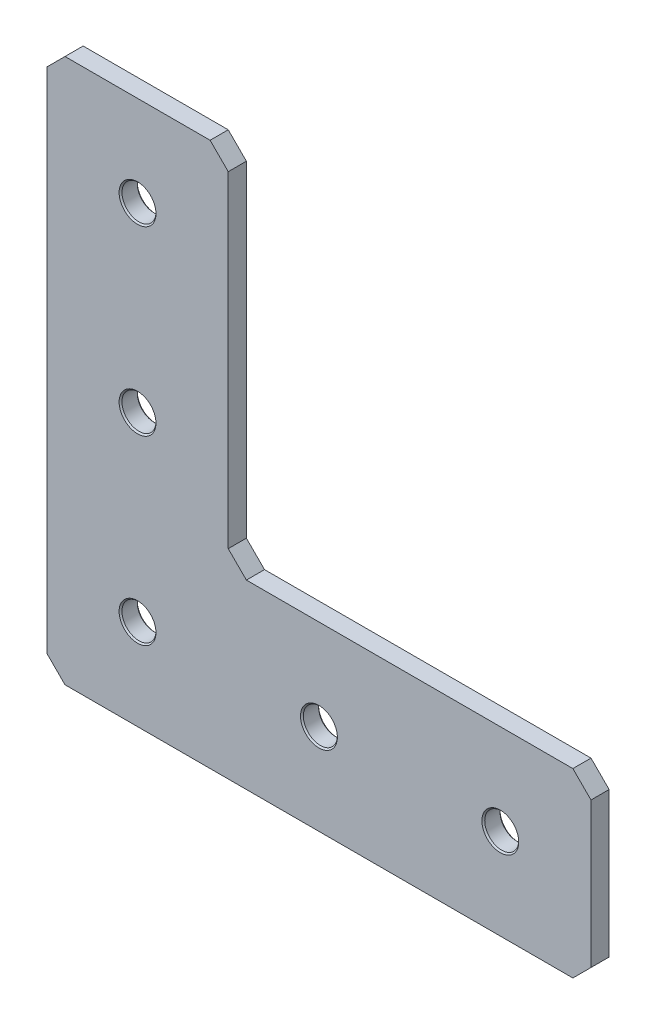
ISO-10303-21;
HEADER;
FILE_DESCRIPTION(('STEP AP214'),'2;1');
FILE_NAME('part.step','',(''),(''),'','','');
FILE_SCHEMA(('AUTOMOTIVE_DESIGN { 1 0 10303 214 1 1 1 1 }'));
ENDSEC;
DATA;
#1=APPLICATION_CONTEXT('core data for automotive mechanical design processes');
#2=APPLICATION_PROTOCOL_DEFINITION('international standard','automotive_design',2000,#1);
#3=PRODUCT_CONTEXT('',#1,'mechanical');
#4=PRODUCT('Part','Part','',(#3));
#5=PRODUCT_RELATED_PRODUCT_CATEGORY('part','',(#4));
#6=PRODUCT_DEFINITION_FORMATION('','',#4);
#7=PRODUCT_DEFINITION_CONTEXT('part definition',#1,'design');
#8=PRODUCT_DEFINITION('design','',#6,#7);
#9=PRODUCT_DEFINITION_SHAPE('','',#8);
#10=(LENGTH_UNIT() NAMED_UNIT(*) SI_UNIT(.MILLI.,.METRE.));
#11=(NAMED_UNIT(*) PLANE_ANGLE_UNIT() SI_UNIT($,.RADIAN.));
#12=(NAMED_UNIT(*) SI_UNIT($,.STERADIAN.) SOLID_ANGLE_UNIT());
#13=UNCERTAINTY_MEASURE_WITH_UNIT(LENGTH_MEASURE(1.E-05),#10,'distance_accuracy_value','');
#14=(GEOMETRIC_REPRESENTATION_CONTEXT(3) GLOBAL_UNCERTAINTY_ASSIGNED_CONTEXT((#13)) GLOBAL_UNIT_ASSIGNED_CONTEXT((#10,
#11,#12)) REPRESENTATION_CONTEXT('',''));
#15=CARTESIAN_POINT('',(0.,0.,0.));
#16=DIRECTION('',(0.,0.,1.));
#17=DIRECTION('',(1.,0.,0.));
#18=AXIS2_PLACEMENT_3D('',#15,#16,#17);
#19=CARTESIAN_POINT('',(0.,0.,2.54));
#20=DIRECTION('',(0.,-1.,0.));
#21=DIRECTION('',(0.,0.,-1.));
#22=AXIS2_PLACEMENT_3D('',#19,#20,#21);
#23=PLANE('',#22);
#24=DIRECTION('',(-1.,0.,0.));
#25=VECTOR('',#24,1.);
#26=CARTESIAN_POINT('',(0.,0.,2.54));
#27=LINE('',#26,#25);
#28=CARTESIAN_POINT('',(48.26,0.,2.54));
#29=VERTEX_POINT('',#28);
#30=CARTESIAN_POINT('',(2.54,0.,2.54));
#31=VERTEX_POINT('',#30);
#32=EDGE_CURVE('E151',#29,#31,#27,.T.);
#33=ORIENTED_EDGE('',*,*,#32,.F.);
#34=DIRECTION('',(0.,0.,-1.));
#35=VECTOR('',#34,1.);
#36=CARTESIAN_POINT('',(48.26,0.,2.54));
#37=LINE('',#36,#35);
#38=CARTESIAN_POINT('',(48.26,0.,0.));
#39=VERTEX_POINT('',#38);
#40=EDGE_CURVE('E183',#29,#39,#37,.T.);
#41=ORIENTED_EDGE('',*,*,#40,.T.);
#42=DIRECTION('',(-1.,0.,0.));
#43=VECTOR('',#42,1.);
#44=CARTESIAN_POINT('',(0.,0.,0.));
#45=LINE('',#44,#43);
#46=CARTESIAN_POINT('',(2.54,0.,0.));
#47=VERTEX_POINT('',#46);
#48=EDGE_CURVE('E415',#39,#47,#45,.T.);
#49=ORIENTED_EDGE('',*,*,#48,.T.);
#50=DIRECTION('',(0.,0.,1.));
#51=VECTOR('',#50,1.);
#52=CARTESIAN_POINT('',(2.54,0.,2.54));
#53=LINE('',#52,#51);
#54=EDGE_CURVE('E181',#47,#31,#53,.T.);
#55=ORIENTED_EDGE('',*,*,#54,.T.);
#56=EDGE_LOOP('',(#33,#41,#49,#55));
#57=FACE_BOUND('',#56,.T.);
#58=ADVANCED_FACE('F32',(#57),#23,.F.);
#59=CARTESIAN_POINT('',(0.,0.,2.54));
#60=DIRECTION('',(-1.,0.,0.));
#61=DIRECTION('',(0.,-1.,0.));
#62=AXIS2_PLACEMENT_3D('',#59,#60,#61);
#63=PLANE('',#62);
#64=DIRECTION('',(0.,1.,0.));
#65=VECTOR('',#64,1.);
#66=CARTESIAN_POINT('',(0.,0.,2.54));
#67=LINE('',#66,#65);
#68=CARTESIAN_POINT('',(0.,2.54000000000001,2.54));
#69=VERTEX_POINT('',#68);
#70=CARTESIAN_POINT('',(0.,48.26,2.54));
#71=VERTEX_POINT('',#70);
#72=EDGE_CURVE('E405',#69,#71,#67,.T.);
#73=ORIENTED_EDGE('',*,*,#72,.F.);
#74=DIRECTION('',(0.,0.,-1.));
#75=VECTOR('',#74,1.);
#76=CARTESIAN_POINT('',(0.,2.54000000000001,0.));
#77=LINE('',#76,#75);
#78=CARTESIAN_POINT('',(0.,2.54000000000001,0.));
#79=VERTEX_POINT('',#78);
#80=EDGE_CURVE('E188',#69,#79,#77,.T.);
#81=ORIENTED_EDGE('',*,*,#80,.T.);
#82=DIRECTION('',(0.,1.,0.));
#83=VECTOR('',#82,1.);
#84=CARTESIAN_POINT('',(0.,0.,0.));
#85=LINE('',#84,#83);
#86=CARTESIAN_POINT('',(0.,48.26,0.));
#87=VERTEX_POINT('',#86);
#88=EDGE_CURVE('E411',#79,#87,#85,.T.);
#89=ORIENTED_EDGE('',*,*,#88,.T.);
#90=DIRECTION('',(0.,0.,1.));
#91=VECTOR('',#90,1.);
#92=CARTESIAN_POINT('',(0.,48.26,2.54));
#93=LINE('',#92,#91);
#94=EDGE_CURVE('E186',#87,#71,#93,.T.);
#95=ORIENTED_EDGE('',*,*,#94,.T.);
#96=EDGE_LOOP('',(#73,#81,#89,#95));
#97=FACE_BOUND('',#96,.T.);
#98=ADVANCED_FACE('F283',(#97),#63,.F.);
#99=CARTESIAN_POINT('',(0.,50.8,2.54));
#100=DIRECTION('',(0.,-1.,0.));
#101=DIRECTION('',(1.,0.,0.));
#102=AXIS2_PLACEMENT_3D('',#99,#100,#101);
#103=PLANE('',#102);
#104=DIRECTION('',(-1.,0.,0.));
#105=VECTOR('',#104,1.);
#106=CARTESIAN_POINT('',(0.,50.8,2.54));
#107=LINE('',#106,#105);
#108=CARTESIAN_POINT('',(-2.54000000000001,50.8,2.54));
#109=VERTEX_POINT('',#108);
#110=CARTESIAN_POINT('',(-22.86,50.8,2.54));
#111=VERTEX_POINT('',#110);
#112=EDGE_CURVE('E398',#109,#111,#107,.T.);
#113=ORIENTED_EDGE('',*,*,#112,.F.);
#114=DIRECTION('',(0.,0.,-1.));
#115=VECTOR('',#114,1.);
#116=CARTESIAN_POINT('',(-2.54000000000001,50.8,2.54));
#117=LINE('',#116,#115);
#118=CARTESIAN_POINT('',(-2.54000000000001,50.8,0.));
#119=VERTEX_POINT('',#118);
#120=EDGE_CURVE('E193',#109,#119,#117,.T.);
#121=ORIENTED_EDGE('',*,*,#120,.T.);
#122=DIRECTION('',(-1.,0.,0.));
#123=VECTOR('',#122,1.);
#124=CARTESIAN_POINT('',(0.,50.8,0.));
#125=LINE('',#124,#123);
#126=CARTESIAN_POINT('',(-22.86,50.8,0.));
#127=VERTEX_POINT('',#126);
#128=EDGE_CURVE('E153',#119,#127,#125,.T.);
#129=ORIENTED_EDGE('',*,*,#128,.T.);
#130=DIRECTION('',(0.,0.,1.));
#131=VECTOR('',#130,1.);
#132=CARTESIAN_POINT('',(-22.86,50.8,2.54));
#133=LINE('',#132,#131);
#134=EDGE_CURVE('E191',#127,#111,#133,.T.);
#135=ORIENTED_EDGE('',*,*,#134,.T.);
#136=EDGE_LOOP('',(#113,#121,#129,#135));
#137=FACE_BOUND('',#136,.T.);
#138=ADVANCED_FACE('F289',(#137),#103,.F.);
#139=CARTESIAN_POINT('',(-25.4,0.,2.54));
#140=DIRECTION('',(1.,0.,0.));
#141=DIRECTION('',(0.,1.,0.));
#142=AXIS2_PLACEMENT_3D('',#139,#140,#141);
#143=PLANE('',#142);
#144=DIRECTION('',(0.,-1.,0.));
#145=VECTOR('',#144,1.);
#146=CARTESIAN_POINT('',(-25.4,0.,0.));
#147=LINE('',#146,#145);
#148=CARTESIAN_POINT('',(-25.4,48.26,0.));
#149=VERTEX_POINT('',#148);
#150=CARTESIAN_POINT('',(-25.4,-22.86,0.));
#151=VERTEX_POINT('',#150);
#152=EDGE_CURVE('E149',#149,#151,#147,.T.);
#153=ORIENTED_EDGE('',*,*,#152,.T.);
#154=DIRECTION('',(0.,0.,1.));
#155=VECTOR('',#154,1.);
#156=CARTESIAN_POINT('',(-25.4,-22.86,2.54));
#157=LINE('',#156,#155);
#158=CARTESIAN_POINT('',(-25.4,-22.86,2.54));
#159=VERTEX_POINT('',#158);
#160=EDGE_CURVE('E128',#151,#159,#157,.T.);
#161=ORIENTED_EDGE('',*,*,#160,.T.);
#162=DIRECTION('',(0.,-1.,0.));
#163=VECTOR('',#162,1.);
#164=CARTESIAN_POINT('',(-25.4,0.,2.54));
#165=LINE('',#164,#163);
#166=CARTESIAN_POINT('',(-25.4,48.26,2.54));
#167=VERTEX_POINT('',#166);
#168=EDGE_CURVE('E404',#167,#159,#165,.T.);
#169=ORIENTED_EDGE('',*,*,#168,.F.);
#170=DIRECTION('',(0.,0.,-1.));
#171=VECTOR('',#170,1.);
#172=CARTESIAN_POINT('',(-25.4,48.26,2.54));
#173=LINE('',#172,#171);
#174=EDGE_CURVE('E133',#167,#149,#173,.T.);
#175=ORIENTED_EDGE('',*,*,#174,.T.);
#176=EDGE_LOOP('',(#153,#161,#169,#175));
#177=FACE_BOUND('',#176,.T.);
#178=ADVANCED_FACE('F389',(#177),#143,.F.);
#179=CARTESIAN_POINT('',(-25.4,-25.4,2.54));
#180=DIRECTION('',(0.,1.,0.));
#181=DIRECTION('',(-1.,0.,0.));
#182=AXIS2_PLACEMENT_3D('',#179,#180,#181);
#183=PLANE('',#182);
#184=DIRECTION('',(1.,0.,0.));
#185=VECTOR('',#184,1.);
#186=CARTESIAN_POINT('',(-25.4,-25.4,2.54));
#187=LINE('',#186,#185);
#188=CARTESIAN_POINT('',(-22.86,-25.4,2.54));
#189=VERTEX_POINT('',#188);
#190=CARTESIAN_POINT('',(48.26,-25.4,2.54));
#191=VERTEX_POINT('',#190);
#192=EDGE_CURVE('E142',#189,#191,#187,.T.);
#193=ORIENTED_EDGE('',*,*,#192,.F.);
#194=DIRECTION('',(0.,0.,-1.));
#195=VECTOR('',#194,1.);
#196=CARTESIAN_POINT('',(-22.86,-25.4,2.54));
#197=LINE('',#196,#195);
#198=CARTESIAN_POINT('',(-22.86,-25.4,0.));
#199=VERTEX_POINT('',#198);
#200=EDGE_CURVE('E127',#189,#199,#197,.T.);
#201=ORIENTED_EDGE('',*,*,#200,.T.);
#202=DIRECTION('',(1.,0.,0.));
#203=VECTOR('',#202,1.);
#204=CARTESIAN_POINT('',(-25.4,-25.4,0.));
#205=LINE('',#204,#203);
#206=CARTESIAN_POINT('',(48.26,-25.4,0.));
#207=VERTEX_POINT('',#206);
#208=EDGE_CURVE('E140',#199,#207,#205,.T.);
#209=ORIENTED_EDGE('',*,*,#208,.T.);
#210=DIRECTION('',(0.,0.,1.));
#211=VECTOR('',#210,1.);
#212=CARTESIAN_POINT('',(48.26,-25.4,2.54));
#213=LINE('',#212,#211);
#214=EDGE_CURVE('E144',#207,#191,#213,.T.);
#215=ORIENTED_EDGE('',*,*,#214,.T.);
#216=EDGE_LOOP('',(#193,#201,#209,#215));
#217=FACE_BOUND('',#216,.T.);
#218=ADVANCED_FACE('F139',(#217),#183,.F.);
#219=CARTESIAN_POINT('',(50.8,0.,2.54));
#220=DIRECTION('',(-1.,0.,0.));
#221=DIRECTION('',(0.,0.,1.));
#222=AXIS2_PLACEMENT_3D('',#219,#220,#221);
#223=PLANE('',#222);
#224=DIRECTION('',(0.,1.,0.));
#225=VECTOR('',#224,1.);
#226=CARTESIAN_POINT('',(50.8,0.,2.54));
#227=LINE('',#226,#225);
#228=CARTESIAN_POINT('',(50.8,-22.86,2.54));
#229=VERTEX_POINT('',#228);
#230=CARTESIAN_POINT('',(50.8,-2.54000000000002,2.54));
#231=VERTEX_POINT('',#230);
#232=EDGE_CURVE('E157',#229,#231,#227,.T.);
#233=ORIENTED_EDGE('',*,*,#232,.F.);
#234=DIRECTION('',(0.,0.,-1.));
#235=VECTOR('',#234,1.);
#236=CARTESIAN_POINT('',(50.8,-22.86,2.54));
#237=LINE('',#236,#235);
#238=CARTESIAN_POINT('',(50.8,-22.86,0.));
#239=VERTEX_POINT('',#238);
#240=EDGE_CURVE('E178',#229,#239,#237,.T.);
#241=ORIENTED_EDGE('',*,*,#240,.T.);
#242=DIRECTION('',(0.,1.,0.));
#243=VECTOR('',#242,1.);
#244=CARTESIAN_POINT('',(50.8,0.,0.));
#245=LINE('',#244,#243);
#246=CARTESIAN_POINT('',(50.8,-2.54000000000001,0.));
#247=VERTEX_POINT('',#246);
#248=EDGE_CURVE('E148',#239,#247,#245,.T.);
#249=ORIENTED_EDGE('',*,*,#248,.T.);
#250=DIRECTION('',(0.,0.,1.));
#251=VECTOR('',#250,1.);
#252=CARTESIAN_POINT('',(50.8,-2.54000000000001,2.54));
#253=LINE('',#252,#251);
#254=EDGE_CURVE('E47',#247,#231,#253,.T.);
#255=ORIENTED_EDGE('',*,*,#254,.T.);
#256=EDGE_LOOP('',(#233,#241,#249,#255));
#257=FACE_BOUND('',#256,.T.);
#258=ADVANCED_FACE('F381',(#257),#223,.F.);
#259=CARTESIAN_POINT('',(0.,0.,2.54));
#260=DIRECTION('',(0.,0.,-1.));
#261=DIRECTION('',(-1.,0.,0.));
#262=AXIS2_PLACEMENT_3D('',#259,#260,#261);
#263=PLANE('',#262);
#264=CARTESIAN_POINT('',(38.1,-12.7,2.54));
#265=DIRECTION('',(0.,0.,-1.));
#266=DIRECTION('',(-1.,0.,0.));
#267=AXIS2_PLACEMENT_3D('',#264,#265,#266);
#268=CIRCLE('',#267,2.58124999999999);
#269=CARTESIAN_POINT('',(35.51875,-12.7,2.54));
#270=VERTEX_POINT('',#269);
#271=EDGE_CURVE('E11',#270,#270,#268,.T.);
#272=ORIENTED_EDGE('',*,*,#271,.T.);
#273=EDGE_LOOP('',(#272));
#274=FACE_BOUND('',#273,.T.);
#275=CARTESIAN_POINT('',(12.7,-12.7,2.54));
#276=DIRECTION('',(0.,0.,-1.));
#277=DIRECTION('',(-1.,0.,0.));
#278=AXIS2_PLACEMENT_3D('',#275,#276,#277);
#279=CIRCLE('',#278,2.58124999999999);
#280=CARTESIAN_POINT('',(10.11875,-12.7,2.54));
#281=VERTEX_POINT('',#280);
#282=EDGE_CURVE('E40',#281,#281,#279,.T.);
#283=ORIENTED_EDGE('',*,*,#282,.T.);
#284=EDGE_LOOP('',(#283));
#285=FACE_BOUND('',#284,.T.);
#286=CARTESIAN_POINT('',(-12.7,-12.7,2.54));
#287=DIRECTION('',(0.,0.,-1.));
#288=DIRECTION('',(-1.,0.,0.));
#289=AXIS2_PLACEMENT_3D('',#286,#287,#288);
#290=CIRCLE('',#289,2.58124999999999);
#291=CARTESIAN_POINT('',(-15.28125,-12.7,2.54));
#292=VERTEX_POINT('',#291);
#293=EDGE_CURVE('E251',#292,#292,#290,.T.);
#294=ORIENTED_EDGE('',*,*,#293,.T.);
#295=EDGE_LOOP('',(#294));
#296=FACE_BOUND('',#295,.T.);
#297=CARTESIAN_POINT('',(-12.7,12.7,2.54));
#298=DIRECTION('',(0.,0.,-1.));
#299=DIRECTION('',(-1.,0.,0.));
#300=AXIS2_PLACEMENT_3D('',#297,#298,#299);
#301=CIRCLE('',#300,2.58124999999999);
#302=CARTESIAN_POINT('',(-15.28125,12.7,2.54));
#303=VERTEX_POINT('',#302);
#304=EDGE_CURVE('E248',#303,#303,#301,.T.);
#305=ORIENTED_EDGE('',*,*,#304,.T.);
#306=EDGE_LOOP('',(#305));
#307=FACE_BOUND('',#306,.T.);
#308=CARTESIAN_POINT('',(-12.7,38.1,2.54));
#309=DIRECTION('',(0.,0.,-1.));
#310=DIRECTION('',(-1.,0.,0.));
#311=AXIS2_PLACEMENT_3D('',#308,#309,#310);
#312=CIRCLE('',#311,2.58124999999999);
#313=CARTESIAN_POINT('',(-15.28125,38.1,2.54));
#314=VERTEX_POINT('',#313);
#315=EDGE_CURVE('E245',#314,#314,#312,.T.);
#316=ORIENTED_EDGE('',*,*,#315,.T.);
#317=EDGE_LOOP('',(#316));
#318=FACE_BOUND('',#317,.T.);
#319=ORIENTED_EDGE('',*,*,#168,.T.);
#320=DIRECTION('',(-0.707106781186546,0.70710678118655,0.));
#321=VECTOR('',#320,1.);
#322=CARTESIAN_POINT('',(-22.86,-25.4,2.54));
#323=LINE('',#322,#321);
#324=EDGE_CURVE('E175',#159,#189,#323,.F.);
#325=ORIENTED_EDGE('',*,*,#324,.T.);
#326=ORIENTED_EDGE('',*,*,#192,.T.);
#327=DIRECTION('',(-0.70710678118655,-0.707106781186546,0.));
#328=VECTOR('',#327,1.);
#329=CARTESIAN_POINT('',(50.8,-22.86,2.54));
#330=LINE('',#329,#328);
#331=EDGE_CURVE('E54',#191,#229,#330,.F.);
#332=ORIENTED_EDGE('',*,*,#331,.T.);
#333=ORIENTED_EDGE('',*,*,#232,.T.);
#334=DIRECTION('',(0.707106781186546,-0.70710678118655,0.));
#335=VECTOR('',#334,1.);
#336=CARTESIAN_POINT('',(48.26,0.,2.54));
#337=LINE('',#336,#335);
#338=EDGE_CURVE('E172',#231,#29,#337,.F.);
#339=ORIENTED_EDGE('',*,*,#338,.T.);
#340=ORIENTED_EDGE('',*,*,#32,.T.);
#341=DIRECTION('',(0.707106781186546,-0.70710678118655,0.));
#342=VECTOR('',#341,1.);
#343=CARTESIAN_POINT('',(1.27000000000001,1.27,2.54));
#344=LINE('',#343,#342);
#345=EDGE_CURVE('E198',#31,#69,#344,.F.);
#346=ORIENTED_EDGE('',*,*,#345,.T.);
#347=ORIENTED_EDGE('',*,*,#72,.T.);
#348=DIRECTION('',(0.707106781186546,-0.70710678118655,0.));
#349=VECTOR('',#348,1.);
#350=CARTESIAN_POINT('',(-2.54000000000001,50.8,2.54));
#351=LINE('',#350,#349);
#352=EDGE_CURVE('E170',#71,#109,#351,.F.);
#353=ORIENTED_EDGE('',*,*,#352,.T.);
#354=ORIENTED_EDGE('',*,*,#112,.T.);
#355=DIRECTION('',(0.707106781186549,0.707106781186546,0.));
#356=VECTOR('',#355,1.);
#357=CARTESIAN_POINT('',(-25.4,48.26,2.54));
#358=LINE('',#357,#356);
#359=EDGE_CURVE('E168',#111,#167,#358,.F.);
#360=ORIENTED_EDGE('',*,*,#359,.T.);
#361=EDGE_LOOP('',(#319,#325,#326,#332,#333,#339,#340,#346,#347,#353,#354,#360));
#362=FACE_BOUND('',#361,.T.);
#363=ADVANCED_FACE('F256',(#274,#285,#296,#307,#318,#362),#263,.F.);
#364=CARTESIAN_POINT('',(0.,0.,0.));
#365=DIRECTION('',(0.,0.,-1.));
#366=DIRECTION('',(-1.,0.,0.));
#367=AXIS2_PLACEMENT_3D('',#364,#365,#366);
#368=PLANE('',#367);
#369=CARTESIAN_POINT('',(-12.7,38.1,0.));
#370=DIRECTION('',(0.,0.,-1.));
#371=DIRECTION('',(-1.,0.,0.));
#372=AXIS2_PLACEMENT_3D('',#369,#370,#371);
#373=CIRCLE('',#372,2.58124999999999);
#374=CARTESIAN_POINT('',(-15.28125,38.1,0.));
#375=VERTEX_POINT('',#374);
#376=EDGE_CURVE('E212',#375,#375,#373,.F.);
#377=ORIENTED_EDGE('',*,*,#376,.T.);
#378=EDGE_LOOP('',(#377));
#379=FACE_BOUND('',#378,.T.);
#380=CARTESIAN_POINT('',(-12.7,12.7,0.));
#381=DIRECTION('',(0.,0.,-1.));
#382=DIRECTION('',(-1.,0.,0.));
#383=AXIS2_PLACEMENT_3D('',#380,#381,#382);
#384=CIRCLE('',#383,2.58124999999999);
#385=CARTESIAN_POINT('',(-15.28125,12.7,0.));
#386=VERTEX_POINT('',#385);
#387=EDGE_CURVE('E209',#386,#386,#384,.F.);
#388=ORIENTED_EDGE('',*,*,#387,.T.);
#389=EDGE_LOOP('',(#388));
#390=FACE_BOUND('',#389,.T.);
#391=CARTESIAN_POINT('',(-12.7,-12.7,0.));
#392=DIRECTION('',(0.,0.,-1.));
#393=DIRECTION('',(-1.,0.,0.));
#394=AXIS2_PLACEMENT_3D('',#391,#392,#393);
#395=CIRCLE('',#394,2.58124999999999);
#396=CARTESIAN_POINT('',(-15.28125,-12.7,0.));
#397=VERTEX_POINT('',#396);
#398=EDGE_CURVE('E206',#397,#397,#395,.F.);
#399=ORIENTED_EDGE('',*,*,#398,.T.);
#400=EDGE_LOOP('',(#399));
#401=FACE_BOUND('',#400,.T.);
#402=CARTESIAN_POINT('',(12.7,-12.7,0.));
#403=DIRECTION('',(0.,0.,-1.));
#404=DIRECTION('',(-1.,0.,0.));
#405=AXIS2_PLACEMENT_3D('',#402,#403,#404);
#406=CIRCLE('',#405,2.58124999999999);
#407=CARTESIAN_POINT('',(10.11875,-12.7,0.));
#408=VERTEX_POINT('',#407);
#409=EDGE_CURVE('E203',#408,#408,#406,.F.);
#410=ORIENTED_EDGE('',*,*,#409,.T.);
#411=EDGE_LOOP('',(#410));
#412=FACE_BOUND('',#411,.T.);
#413=CARTESIAN_POINT('',(38.1,-12.7,0.));
#414=DIRECTION('',(0.,0.,-1.));
#415=DIRECTION('',(-1.,0.,0.));
#416=AXIS2_PLACEMENT_3D('',#413,#414,#415);
#417=CIRCLE('',#416,2.58124999999999);
#418=CARTESIAN_POINT('',(35.51875,-12.7,0.));
#419=VERTEX_POINT('',#418);
#420=EDGE_CURVE('E200',#419,#419,#417,.F.);
#421=ORIENTED_EDGE('',*,*,#420,.T.);
#422=EDGE_LOOP('',(#421));
#423=FACE_BOUND('',#422,.T.);
#424=ORIENTED_EDGE('',*,*,#208,.F.);
#425=DIRECTION('',(0.707106781186546,-0.70710678118655,0.));
#426=VECTOR('',#425,1.);
#427=CARTESIAN_POINT('',(-24.1300000000001,-24.1299999999999,0.));
#428=LINE('',#427,#426);
#429=EDGE_CURVE('E123',#199,#151,#428,.F.);
#430=ORIENTED_EDGE('',*,*,#429,.T.);
#431=ORIENTED_EDGE('',*,*,#152,.F.);
#432=DIRECTION('',(-0.707106781186549,-0.707106781186546,0.));
#433=VECTOR('',#432,1.);
#434=CARTESIAN_POINT('',(-36.8299999999999,36.8300000000001,0.));
#435=LINE('',#434,#433);
#436=EDGE_CURVE('E143',#149,#127,#435,.F.);
#437=ORIENTED_EDGE('',*,*,#436,.T.);
#438=ORIENTED_EDGE('',*,*,#128,.F.);
#439=DIRECTION('',(-0.707106781186546,0.70710678118655,0.));
#440=VECTOR('',#439,1.);
#441=CARTESIAN_POINT('',(24.13,24.1299999999999,0.));
#442=LINE('',#441,#440);
#443=EDGE_CURVE('E160',#119,#87,#442,.F.);
#444=ORIENTED_EDGE('',*,*,#443,.T.);
#445=ORIENTED_EDGE('',*,*,#88,.F.);
#446=DIRECTION('',(-0.707106781186546,0.70710678118655,0.));
#447=VECTOR('',#446,1.);
#448=CARTESIAN_POINT('',(0.,2.54000000000001,0.));
#449=LINE('',#448,#447);
#450=EDGE_CURVE('E196',#79,#47,#449,.F.);
#451=ORIENTED_EDGE('',*,*,#450,.T.);
#452=ORIENTED_EDGE('',*,*,#48,.F.);
#453=DIRECTION('',(-0.707106781186546,0.70710678118655,0.));
#454=VECTOR('',#453,1.);
#455=CARTESIAN_POINT('',(24.1300000000001,24.13,0.));
#456=LINE('',#455,#454);
#457=EDGE_CURVE('E162',#39,#247,#456,.F.);
#458=ORIENTED_EDGE('',*,*,#457,.T.);
#459=ORIENTED_EDGE('',*,*,#248,.F.);
#460=DIRECTION('',(0.70710678118655,0.707106781186546,0.));
#461=VECTOR('',#460,1.);
#462=CARTESIAN_POINT('',(36.8299999999999,-36.8300000000001,0.));
#463=LINE('',#462,#461);
#464=EDGE_CURVE('E134',#239,#207,#463,.F.);
#465=ORIENTED_EDGE('',*,*,#464,.T.);
#466=EDGE_LOOP('',(#424,#430,#431,#437,#438,#444,#445,#451,#452,#458,#459,#465));
#467=FACE_BOUND('',#466,.T.);
#468=ADVANCED_FACE('F146',(#379,#390,#401,#412,#423,#467),#368,.T.);
#469=CARTESIAN_POINT('',(38.1,-12.7,2.54));
#470=DIRECTION('',(0.,0.,1.));
#471=DIRECTION('',(1.,0.,0.));
#472=AXIS2_PLACEMENT_3D('',#469,#470,#471);
#473=CYLINDRICAL_SURFACE('',#472,2.38124999999999);
#474=CARTESIAN_POINT('',(38.1,-12.7,0.200000000000014));
#475=DIRECTION('',(0.,0.,-1.));
#476=DIRECTION('',(-1.,0.,0.));
#477=AXIS2_PLACEMENT_3D('',#474,#475,#476);
#478=CIRCLE('',#477,2.38124999999999);
#479=CARTESIAN_POINT('',(35.71875,-12.7,0.200000000000014));
#480=VERTEX_POINT('',#479);
#481=EDGE_CURVE('E242',#480,#480,#478,.T.);
#482=ORIENTED_EDGE('',*,*,#481,.T.);
#483=EDGE_LOOP('',(#482));
#484=FACE_BOUND('',#483,.T.);
#485=CARTESIAN_POINT('',(38.1,-12.7,2.34000000000001));
#486=DIRECTION('',(0.,0.,-1.));
#487=DIRECTION('',(-1.,0.,0.));
#488=AXIS2_PLACEMENT_3D('',#485,#486,#487);
#489=CIRCLE('',#488,2.38124999999999);
#490=CARTESIAN_POINT('',(35.71875,-12.7,2.34000000000001));
#491=VERTEX_POINT('',#490);
#492=EDGE_CURVE('E239',#491,#491,#489,.F.);
#493=ORIENTED_EDGE('',*,*,#492,.T.);
#494=EDGE_LOOP('',(#493));
#495=FACE_BOUND('',#494,.T.);
#496=ADVANCED_FACE('F270',(#484,#495),#473,.F.);
#497=CARTESIAN_POINT('',(12.7,-12.7,2.54));
#498=DIRECTION('',(0.,0.,1.));
#499=DIRECTION('',(1.,0.,0.));
#500=AXIS2_PLACEMENT_3D('',#497,#498,#499);
#501=CYLINDRICAL_SURFACE('',#500,2.38124999999999);
#502=CARTESIAN_POINT('',(12.7,-12.7,0.200000000000014));
#503=DIRECTION('',(0.,0.,-1.));
#504=DIRECTION('',(-1.,0.,0.));
#505=AXIS2_PLACEMENT_3D('',#502,#503,#504);
#506=CIRCLE('',#505,2.38124999999999);
#507=CARTESIAN_POINT('',(10.31875,-12.7,0.200000000000014));
#508=VERTEX_POINT('',#507);
#509=EDGE_CURVE('E236',#508,#508,#506,.T.);
#510=ORIENTED_EDGE('',*,*,#509,.T.);
#511=EDGE_LOOP('',(#510));
#512=FACE_BOUND('',#511,.T.);
#513=CARTESIAN_POINT('',(12.7,-12.7,2.34000000000001));
#514=DIRECTION('',(0.,0.,-1.));
#515=DIRECTION('',(-1.,0.,0.));
#516=AXIS2_PLACEMENT_3D('',#513,#514,#515);
#517=CIRCLE('',#516,2.38124999999999);
#518=CARTESIAN_POINT('',(10.31875,-12.7,2.34000000000001));
#519=VERTEX_POINT('',#518);
#520=EDGE_CURVE('E233',#519,#519,#517,.F.);
#521=ORIENTED_EDGE('',*,*,#520,.T.);
#522=EDGE_LOOP('',(#521));
#523=FACE_BOUND('',#522,.T.);
#524=ADVANCED_FACE('F267',(#512,#523),#501,.F.);
#525=CARTESIAN_POINT('',(-12.7,-12.7,2.54));
#526=DIRECTION('',(0.,0.,1.));
#527=DIRECTION('',(1.,0.,0.));
#528=AXIS2_PLACEMENT_3D('',#525,#526,#527);
#529=CYLINDRICAL_SURFACE('',#528,2.38124999999999);
#530=CARTESIAN_POINT('',(-12.7,-12.7,0.200000000000014));
#531=DIRECTION('',(0.,0.,-1.));
#532=DIRECTION('',(-1.,0.,0.));
#533=AXIS2_PLACEMENT_3D('',#530,#531,#532);
#534=CIRCLE('',#533,2.38124999999999);
#535=CARTESIAN_POINT('',(-15.08125,-12.7,0.200000000000014));
#536=VERTEX_POINT('',#535);
#537=EDGE_CURVE('E230',#536,#536,#534,.T.);
#538=ORIENTED_EDGE('',*,*,#537,.T.);
#539=EDGE_LOOP('',(#538));
#540=FACE_BOUND('',#539,.T.);
#541=CARTESIAN_POINT('',(-12.7,-12.7,2.34000000000001));
#542=DIRECTION('',(0.,0.,-1.));
#543=DIRECTION('',(-1.,0.,0.));
#544=AXIS2_PLACEMENT_3D('',#541,#542,#543);
#545=CIRCLE('',#544,2.38124999999999);
#546=CARTESIAN_POINT('',(-15.08125,-12.7,2.34000000000001));
#547=VERTEX_POINT('',#546);
#548=EDGE_CURVE('E227',#547,#547,#545,.F.);
#549=ORIENTED_EDGE('',*,*,#548,.T.);
#550=EDGE_LOOP('',(#549));
#551=FACE_BOUND('',#550,.T.);
#552=ADVANCED_FACE('F269',(#540,#551),#529,.F.);
#553=CARTESIAN_POINT('',(-12.7,12.7,2.54));
#554=DIRECTION('',(0.,0.,1.));
#555=DIRECTION('',(1.,0.,0.));
#556=AXIS2_PLACEMENT_3D('',#553,#554,#555);
#557=CYLINDRICAL_SURFACE('',#556,2.38124999999999);
#558=CARTESIAN_POINT('',(-12.7,12.7,0.200000000000014));
#559=DIRECTION('',(0.,0.,-1.));
#560=DIRECTION('',(-1.,0.,0.));
#561=AXIS2_PLACEMENT_3D('',#558,#559,#560);
#562=CIRCLE('',#561,2.38124999999999);
#563=CARTESIAN_POINT('',(-15.08125,12.7,0.200000000000014));
#564=VERTEX_POINT('',#563);
#565=EDGE_CURVE('E224',#564,#564,#562,.T.);
#566=ORIENTED_EDGE('',*,*,#565,.T.);
#567=EDGE_LOOP('',(#566));
#568=FACE_BOUND('',#567,.T.);
#569=CARTESIAN_POINT('',(-12.7,12.7,2.34000000000001));
#570=DIRECTION('',(0.,0.,-1.));
#571=DIRECTION('',(-1.,0.,0.));
#572=AXIS2_PLACEMENT_3D('',#569,#570,#571);
#573=CIRCLE('',#572,2.38124999999999);
#574=CARTESIAN_POINT('',(-15.08125,12.7,2.34000000000001));
#575=VERTEX_POINT('',#574);
#576=EDGE_CURVE('E221',#575,#575,#573,.F.);
#577=ORIENTED_EDGE('',*,*,#576,.T.);
#578=EDGE_LOOP('',(#577));
#579=FACE_BOUND('',#578,.T.);
#580=ADVANCED_FACE('F277',(#568,#579),#557,.F.);
#581=CARTESIAN_POINT('',(-12.7,38.1,2.54));
#582=DIRECTION('',(0.,0.,1.));
#583=DIRECTION('',(1.,0.,0.));
#584=AXIS2_PLACEMENT_3D('',#581,#582,#583);
#585=CYLINDRICAL_SURFACE('',#584,2.38124999999999);
#586=CARTESIAN_POINT('',(-12.7,38.1,0.200000000000014));
#587=DIRECTION('',(0.,0.,-1.));
#588=DIRECTION('',(-1.,0.,0.));
#589=AXIS2_PLACEMENT_3D('',#586,#587,#588);
#590=CIRCLE('',#589,2.38124999999999);
#591=CARTESIAN_POINT('',(-15.08125,38.1,0.200000000000014));
#592=VERTEX_POINT('',#591);
#593=EDGE_CURVE('E218',#592,#592,#590,.T.);
#594=ORIENTED_EDGE('',*,*,#593,.T.);
#595=EDGE_LOOP('',(#594));
#596=FACE_BOUND('',#595,.T.);
#597=CARTESIAN_POINT('',(-12.7,38.1,2.34000000000001));
#598=DIRECTION('',(0.,0.,-1.));
#599=DIRECTION('',(-1.,0.,0.));
#600=AXIS2_PLACEMENT_3D('',#597,#598,#599);
#601=CIRCLE('',#600,2.38124999999999);
#602=CARTESIAN_POINT('',(-15.08125,38.1,2.34000000000001));
#603=VERTEX_POINT('',#602);
#604=EDGE_CURVE('E215',#603,#603,#601,.F.);
#605=ORIENTED_EDGE('',*,*,#604,.T.);
#606=EDGE_LOOP('',(#605));
#607=FACE_BOUND('',#606,.T.);
#608=ADVANCED_FACE('F298',(#596,#607),#585,.F.);
#609=CARTESIAN_POINT('',(-22.86,-25.4,2.54));
#610=DIRECTION('',(0.70710678118655,0.707106781186546,0.));
#611=DIRECTION('',(0.,0.,-1.));
#612=AXIS2_PLACEMENT_3D('',#609,#610,#611);
#613=PLANE('',#612);
#614=ORIENTED_EDGE('',*,*,#324,.F.);
#615=ORIENTED_EDGE('',*,*,#160,.F.);
#616=ORIENTED_EDGE('',*,*,#429,.F.);
#617=ORIENTED_EDGE('',*,*,#200,.F.);
#618=EDGE_LOOP('',(#614,#615,#616,#617));
#619=FACE_BOUND('',#618,.T.);
#620=ADVANCED_FACE('F126',(#619),#613,.F.);
#621=CARTESIAN_POINT('',(50.8,-22.86,2.54));
#622=DIRECTION('',(-0.707106781186546,0.70710678118655,0.));
#623=DIRECTION('',(0.,0.,-1.));
#624=AXIS2_PLACEMENT_3D('',#621,#622,#623);
#625=PLANE('',#624);
#626=ORIENTED_EDGE('',*,*,#331,.F.);
#627=ORIENTED_EDGE('',*,*,#214,.F.);
#628=ORIENTED_EDGE('',*,*,#464,.F.);
#629=ORIENTED_EDGE('',*,*,#240,.F.);
#630=EDGE_LOOP('',(#626,#627,#628,#629));
#631=FACE_BOUND('',#630,.T.);
#632=ADVANCED_FACE('F297',(#631),#625,.F.);
#633=CARTESIAN_POINT('',(48.26,0.,2.54));
#634=DIRECTION('',(-0.70710678118655,-0.707106781186546,0.));
#635=DIRECTION('',(0.,0.,-1.));
#636=AXIS2_PLACEMENT_3D('',#633,#634,#635);
#637=PLANE('',#636);
#638=ORIENTED_EDGE('',*,*,#338,.F.);
#639=ORIENTED_EDGE('',*,*,#254,.F.);
#640=ORIENTED_EDGE('',*,*,#457,.F.);
#641=ORIENTED_EDGE('',*,*,#40,.F.);
#642=EDGE_LOOP('',(#638,#639,#640,#641));
#643=FACE_BOUND('',#642,.T.);
#644=ADVANCED_FACE('F301',(#643),#637,.F.);
#645=CARTESIAN_POINT('',(0.,2.54000000000001,2.54));
#646=DIRECTION('',(0.70710678118655,0.707106781186546,0.));
#647=DIRECTION('',(0.,0.,1.));
#648=AXIS2_PLACEMENT_3D('',#645,#646,#647);
#649=PLANE('',#648);
#650=ORIENTED_EDGE('',*,*,#345,.F.);
#651=ORIENTED_EDGE('',*,*,#54,.F.);
#652=ORIENTED_EDGE('',*,*,#450,.F.);
#653=ORIENTED_EDGE('',*,*,#80,.F.);
#654=EDGE_LOOP('',(#650,#651,#652,#653));
#655=FACE_BOUND('',#654,.T.);
#656=ADVANCED_FACE('F305',(#655),#649,.T.);
#657=CARTESIAN_POINT('',(-2.54000000000001,50.8,2.54));
#658=DIRECTION('',(-0.70710678118655,-0.707106781186546,0.));
#659=DIRECTION('',(0.,0.,-1.));
#660=AXIS2_PLACEMENT_3D('',#657,#658,#659);
#661=PLANE('',#660);
#662=ORIENTED_EDGE('',*,*,#352,.F.);
#663=ORIENTED_EDGE('',*,*,#94,.F.);
#664=ORIENTED_EDGE('',*,*,#443,.F.);
#665=ORIENTED_EDGE('',*,*,#120,.F.);
#666=EDGE_LOOP('',(#662,#663,#664,#665));
#667=FACE_BOUND('',#666,.T.);
#668=ADVANCED_FACE('F309',(#667),#661,.F.);
#669=CARTESIAN_POINT('',(-25.4,48.26,2.54));
#670=DIRECTION('',(0.707106781186546,-0.707106781186549,0.));
#671=DIRECTION('',(0.,0.,-1.));
#672=AXIS2_PLACEMENT_3D('',#669,#670,#671);
#673=PLANE('',#672);
#674=ORIENTED_EDGE('',*,*,#359,.F.);
#675=ORIENTED_EDGE('',*,*,#134,.F.);
#676=ORIENTED_EDGE('',*,*,#436,.F.);
#677=ORIENTED_EDGE('',*,*,#174,.F.);
#678=EDGE_LOOP('',(#674,#675,#676,#677));
#679=FACE_BOUND('',#678,.T.);
#680=ADVANCED_FACE('F313',(#679),#673,.F.);
#681=CARTESIAN_POINT('',(-12.7,38.1,0.));
#682=DIRECTION('',(0.,0.,-1.));
#683=DIRECTION('',(-1.,0.,0.));
#684=AXIS2_PLACEMENT_3D('',#681,#682,#683);
#685=CONICAL_SURFACE('',#684,2.58124999999999,0.785398163397429);
#686=ORIENTED_EDGE('',*,*,#593,.F.);
#687=EDGE_LOOP('',(#686));
#688=FACE_BOUND('',#687,.T.);
#689=ORIENTED_EDGE('',*,*,#376,.F.);
#690=EDGE_LOOP('',(#689));
#691=FACE_BOUND('',#690,.T.);
#692=ADVANCED_FACE('F317',(#688,#691),#685,.F.);
#693=CARTESIAN_POINT('',(-12.7,12.7,0.));
#694=DIRECTION('',(0.,0.,-1.));
#695=DIRECTION('',(-1.,0.,0.));
#696=AXIS2_PLACEMENT_3D('',#693,#694,#695);
#697=CONICAL_SURFACE('',#696,2.58124999999999,0.785398163397429);
#698=ORIENTED_EDGE('',*,*,#565,.F.);
#699=EDGE_LOOP('',(#698));
#700=FACE_BOUND('',#699,.T.);
#701=ORIENTED_EDGE('',*,*,#387,.F.);
#702=EDGE_LOOP('',(#701));
#703=FACE_BOUND('',#702,.T.);
#704=ADVANCED_FACE('F321',(#700,#703),#697,.F.);
#705=CARTESIAN_POINT('',(-12.7,-12.7,0.));
#706=DIRECTION('',(0.,0.,-1.));
#707=DIRECTION('',(-1.,0.,0.));
#708=AXIS2_PLACEMENT_3D('',#705,#706,#707);
#709=CONICAL_SURFACE('',#708,2.58124999999999,0.785398163397429);
#710=ORIENTED_EDGE('',*,*,#537,.F.);
#711=EDGE_LOOP('',(#710));
#712=FACE_BOUND('',#711,.T.);
#713=ORIENTED_EDGE('',*,*,#398,.F.);
#714=EDGE_LOOP('',(#713));
#715=FACE_BOUND('',#714,.T.);
#716=ADVANCED_FACE('F325',(#712,#715),#709,.F.);
#717=CARTESIAN_POINT('',(12.7,-12.7,0.));
#718=DIRECTION('',(0.,0.,-1.));
#719=DIRECTION('',(-1.,0.,0.));
#720=AXIS2_PLACEMENT_3D('',#717,#718,#719);
#721=CONICAL_SURFACE('',#720,2.58124999999999,0.785398163397429);
#722=ORIENTED_EDGE('',*,*,#509,.F.);
#723=EDGE_LOOP('',(#722));
#724=FACE_BOUND('',#723,.T.);
#725=ORIENTED_EDGE('',*,*,#409,.F.);
#726=EDGE_LOOP('',(#725));
#727=FACE_BOUND('',#726,.T.);
#728=ADVANCED_FACE('F329',(#724,#727),#721,.F.);
#729=CARTESIAN_POINT('',(38.1,-12.7,0.));
#730=DIRECTION('',(0.,0.,-1.));
#731=DIRECTION('',(-1.,0.,0.));
#732=AXIS2_PLACEMENT_3D('',#729,#730,#731);
#733=CONICAL_SURFACE('',#732,2.58124999999999,0.785398163397429);
#734=ORIENTED_EDGE('',*,*,#481,.F.);
#735=EDGE_LOOP('',(#734));
#736=FACE_BOUND('',#735,.T.);
#737=ORIENTED_EDGE('',*,*,#420,.F.);
#738=EDGE_LOOP('',(#737));
#739=FACE_BOUND('',#738,.T.);
#740=ADVANCED_FACE('F333',(#736,#739),#733,.F.);
#741=CARTESIAN_POINT('',(38.1,-12.7,2.34000000000001));
#742=DIRECTION('',(0.,0.,1.));
#743=DIRECTION('',(1.,0.,0.));
#744=AXIS2_PLACEMENT_3D('',#741,#742,#743);
#745=CONICAL_SURFACE('',#744,2.38124999999999,0.785398163397485);
#746=ORIENTED_EDGE('',*,*,#271,.F.);
#747=EDGE_LOOP('',(#746));
#748=FACE_BOUND('',#747,.T.);
#749=ORIENTED_EDGE('',*,*,#492,.F.);
#750=EDGE_LOOP('',(#749));
#751=FACE_BOUND('',#750,.T.);
#752=ADVANCED_FACE('F263',(#748,#751),#745,.F.);
#753=CARTESIAN_POINT('',(12.7,-12.7,2.34000000000001));
#754=DIRECTION('',(0.,0.,1.));
#755=DIRECTION('',(1.,0.,0.));
#756=AXIS2_PLACEMENT_3D('',#753,#754,#755);
#757=CONICAL_SURFACE('',#756,2.38124999999999,0.785398163397485);
#758=ORIENTED_EDGE('',*,*,#282,.F.);
#759=EDGE_LOOP('',(#758));
#760=FACE_BOUND('',#759,.T.);
#761=ORIENTED_EDGE('',*,*,#520,.F.);
#762=EDGE_LOOP('',(#761));
#763=FACE_BOUND('',#762,.T.);
#764=ADVANCED_FACE('F259',(#760,#763),#757,.F.);
#765=CARTESIAN_POINT('',(-12.7,-12.7,2.34000000000001));
#766=DIRECTION('',(0.,0.,1.));
#767=DIRECTION('',(1.,0.,0.));
#768=AXIS2_PLACEMENT_3D('',#765,#766,#767);
#769=CONICAL_SURFACE('',#768,2.38124999999999,0.785398163397485);
#770=ORIENTED_EDGE('',*,*,#293,.F.);
#771=EDGE_LOOP('',(#770));
#772=FACE_BOUND('',#771,.T.);
#773=ORIENTED_EDGE('',*,*,#548,.F.);
#774=EDGE_LOOP('',(#773));
#775=FACE_BOUND('',#774,.T.);
#776=ADVANCED_FACE('F262',(#772,#775),#769,.F.);
#777=CARTESIAN_POINT('',(-12.7,12.7,2.34000000000001));
#778=DIRECTION('',(0.,0.,1.));
#779=DIRECTION('',(1.,0.,0.));
#780=AXIS2_PLACEMENT_3D('',#777,#778,#779);
#781=CONICAL_SURFACE('',#780,2.38124999999999,0.785398163397485);
#782=ORIENTED_EDGE('',*,*,#304,.F.);
#783=EDGE_LOOP('',(#782));
#784=FACE_BOUND('',#783,.T.);
#785=ORIENTED_EDGE('',*,*,#576,.F.);
#786=EDGE_LOOP('',(#785));
#787=FACE_BOUND('',#786,.T.);
#788=ADVANCED_FACE('F342',(#784,#787),#781,.F.);
#789=CARTESIAN_POINT('',(-12.7,38.1,2.34000000000001));
#790=DIRECTION('',(0.,0.,1.));
#791=DIRECTION('',(1.,0.,0.));
#792=AXIS2_PLACEMENT_3D('',#789,#790,#791);
#793=CONICAL_SURFACE('',#792,2.38124999999999,0.785398163397485);
#794=ORIENTED_EDGE('',*,*,#315,.F.);
#795=EDGE_LOOP('',(#794));
#796=FACE_BOUND('',#795,.T.);
#797=ORIENTED_EDGE('',*,*,#604,.F.);
#798=EDGE_LOOP('',(#797));
#799=FACE_BOUND('',#798,.T.);
#800=ADVANCED_FACE('F34',(#796,#799),#793,.F.);
#801=CLOSED_SHELL('',(#58,#98,#138,#178,#218,#258,#363,#468,#496,#524,#552,#580,#608,#620,#632,
#644,#656,#668,#680,#692,#704,#716,#728,#740,#752,#764,#776,#788,#800));
#802=MANIFOLD_SOLID_BREP('B2',#801);
#803=ADVANCED_BREP_SHAPE_REPRESENTATION('',(#18,#802),#14);
#804=SHAPE_DEFINITION_REPRESENTATION(#9,#803);
ENDSEC;
END-ISO-10303-21;
